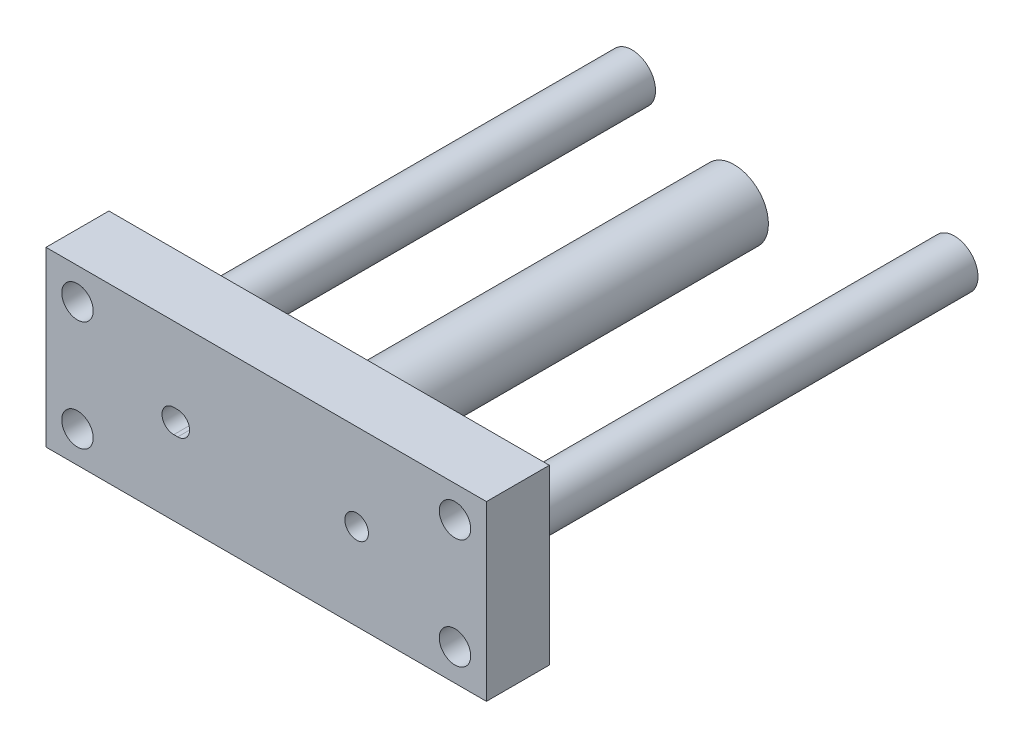
ISO-10303-21;
HEADER;
FILE_DESCRIPTION(('STEP AP214'),'2;1');
FILE_NAME('part.step','',(''),(''),'','','');
FILE_SCHEMA(('AUTOMOTIVE_DESIGN { 1 0 10303 214 1 1 1 1 }'));
ENDSEC;
DATA;
#1=APPLICATION_CONTEXT('core data for automotive mechanical design processes');
#2=APPLICATION_PROTOCOL_DEFINITION('international standard','automotive_design',2000,#1);
#3=PRODUCT_CONTEXT('',#1,'mechanical');
#4=PRODUCT('Part','Part','',(#3));
#5=PRODUCT_RELATED_PRODUCT_CATEGORY('part','',(#4));
#6=PRODUCT_DEFINITION_FORMATION('','',#4);
#7=PRODUCT_DEFINITION_CONTEXT('part definition',#1,'design');
#8=PRODUCT_DEFINITION('design','',#6,#7);
#9=PRODUCT_DEFINITION_SHAPE('','',#8);
#10=(LENGTH_UNIT() NAMED_UNIT(*) SI_UNIT(.MILLI.,.METRE.));
#11=(NAMED_UNIT(*) PLANE_ANGLE_UNIT() SI_UNIT($,.RADIAN.));
#12=(NAMED_UNIT(*) SI_UNIT($,.STERADIAN.) SOLID_ANGLE_UNIT());
#13=UNCERTAINTY_MEASURE_WITH_UNIT(LENGTH_MEASURE(1.E-05),#10,'distance_accuracy_value','');
#14=(GEOMETRIC_REPRESENTATION_CONTEXT(3) GLOBAL_UNCERTAINTY_ASSIGNED_CONTEXT((#13)) GLOBAL_UNIT_ASSIGNED_CONTEXT((#10,
#11,#12)) REPRESENTATION_CONTEXT('',''));
#15=CARTESIAN_POINT('',(0.,0.,0.));
#16=DIRECTION('',(0.,0.,1.));
#17=DIRECTION('',(1.,0.,0.));
#18=AXIS2_PLACEMENT_3D('',#15,#16,#17);
#19=CARTESIAN_POINT('',(-11.25,0.,10.));
#20=DIRECTION('',(0.,0.,1.));
#21=DIRECTION('',(1.,0.,0.));
#22=AXIS2_PLACEMENT_3D('',#19,#20,#21);
#23=PLANE('',#22);
#24=CARTESIAN_POINT('',(-11.5,0.,10.));
#25=DIRECTION('',(0.,0.,1.));
#26=DIRECTION('',(1.,0.,0.));
#27=AXIS2_PLACEMENT_3D('',#24,#25,#26);
#28=CIRCLE('',#27,1.5);
#29=CARTESIAN_POINT('',(-11.5,1.5,10.));
#30=VERTEX_POINT('',#29);
#31=CARTESIAN_POINT('',(-11.5,-1.5,10.));
#32=VERTEX_POINT('',#31);
#33=EDGE_CURVE('E46',#30,#32,#28,.T.);
#34=ORIENTED_EDGE('',*,*,#33,.F.);
#35=DIRECTION('',(-1.,0.,0.));
#36=VECTOR('',#35,1.);
#37=CARTESIAN_POINT('',(-11.75,1.5,10.));
#38=LINE('',#37,#36);
#39=CARTESIAN_POINT('',(-11.75,1.5,10.));
#40=VERTEX_POINT('',#39);
#41=EDGE_CURVE('E112',#30,#40,#38,.T.);
#42=ORIENTED_EDGE('',*,*,#41,.T.);
#43=CARTESIAN_POINT('',(-11.75,0.,10.));
#44=DIRECTION('',(0.,0.,1.));
#45=DIRECTION('',(1.,0.,0.));
#46=AXIS2_PLACEMENT_3D('',#43,#44,#45);
#47=CIRCLE('',#46,1.5);
#48=CARTESIAN_POINT('',(-11.75,-1.5,10.));
#49=VERTEX_POINT('',#48);
#50=EDGE_CURVE('E130',#40,#49,#47,.T.);
#51=ORIENTED_EDGE('',*,*,#50,.T.);
#52=DIRECTION('',(1.,0.,0.));
#53=VECTOR('',#52,1.);
#54=CARTESIAN_POINT('',(-11.75,-1.5,10.));
#55=LINE('',#54,#53);
#56=EDGE_CURVE('E115',#49,#32,#55,.T.);
#57=ORIENTED_EDGE('',*,*,#56,.T.);
#58=EDGE_LOOP('',(#34,#42,#51,#57));
#59=FACE_BOUND('',#58,.T.);
#60=ADVANCED_FACE('F35',(#59),#23,.T.);
#61=CARTESIAN_POINT('',(-28.,-11.,13.));
#62=DIRECTION('',(0.,0.,1.));
#63=DIRECTION('',(1.,0.,0.));
#64=AXIS2_PLACEMENT_3D('',#61,#62,#63);
#65=PLANE('',#64);
#66=CARTESIAN_POINT('',(11.5,0.,13.));
#67=DIRECTION('',(0.,0.,1.));
#68=DIRECTION('',(1.,0.,0.));
#69=AXIS2_PLACEMENT_3D('',#66,#67,#68);
#70=CIRCLE('',#69,1.5);
#71=CARTESIAN_POINT('',(13.,0.,13.));
#72=VERTEX_POINT('',#71);
#73=EDGE_CURVE('E140',#72,#72,#70,.T.);
#74=ORIENTED_EDGE('',*,*,#73,.F.);
#75=EDGE_LOOP('',(#74));
#76=FACE_BOUND('',#75,.T.);
#77=CARTESIAN_POINT('',(-11.25,0.,13.));
#78=DIRECTION('',(0.,0.,1.));
#79=DIRECTION('',(1.,0.,0.));
#80=AXIS2_PLACEMENT_3D('',#77,#78,#79);
#81=CIRCLE('',#80,1.5);
#82=CARTESIAN_POINT('',(-11.25,-1.5,13.));
#83=VERTEX_POINT('',#82);
#84=CARTESIAN_POINT('',(-11.25,1.5,13.));
#85=VERTEX_POINT('',#84);
#86=EDGE_CURVE('E58',#83,#85,#81,.T.);
#87=ORIENTED_EDGE('',*,*,#86,.F.);
#88=DIRECTION('',(1.,0.,0.));
#89=VECTOR('',#88,1.);
#90=CARTESIAN_POINT('',(-11.75,-1.5,13.));
#91=LINE('',#90,#89);
#92=CARTESIAN_POINT('',(-11.75,-1.5,13.));
#93=VERTEX_POINT('',#92);
#94=EDGE_CURVE('E145',#93,#83,#91,.T.);
#95=ORIENTED_EDGE('',*,*,#94,.F.);
#96=CARTESIAN_POINT('',(-11.75,0.,13.));
#97=DIRECTION('',(0.,0.,1.));
#98=DIRECTION('',(1.,0.,0.));
#99=AXIS2_PLACEMENT_3D('',#96,#97,#98);
#100=CIRCLE('',#99,1.5);
#101=CARTESIAN_POINT('',(-11.75,1.5,13.));
#102=VERTEX_POINT('',#101);
#103=EDGE_CURVE('E142',#102,#93,#100,.T.);
#104=ORIENTED_EDGE('',*,*,#103,.F.);
#105=DIRECTION('',(-1.,0.,0.));
#106=VECTOR('',#105,1.);
#107=CARTESIAN_POINT('',(-11.75,1.5,13.));
#108=LINE('',#107,#106);
#109=EDGE_CURVE('E139',#85,#102,#108,.T.);
#110=ORIENTED_EDGE('',*,*,#109,.F.);
#111=EDGE_LOOP('',(#87,#95,#104,#110));
#112=FACE_BOUND('',#111,.T.);
#113=CARTESIAN_POINT('',(-24.,-7.,13.));
#114=DIRECTION('',(0.,0.,-1.));
#115=DIRECTION('',(1.,0.,0.));
#116=AXIS2_PLACEMENT_3D('',#113,#114,#115);
#117=CIRCLE('',#116,2.);
#118=CARTESIAN_POINT('',(-22.,-7.,13.));
#119=VERTEX_POINT('',#118);
#120=EDGE_CURVE('E164',#119,#119,#117,.T.);
#121=ORIENTED_EDGE('',*,*,#120,.T.);
#122=EDGE_LOOP('',(#121));
#123=FACE_BOUND('',#122,.T.);
#124=CARTESIAN_POINT('',(-24.,7.,13.));
#125=DIRECTION('',(0.,0.,1.));
#126=DIRECTION('',(1.,0.,0.));
#127=AXIS2_PLACEMENT_3D('',#124,#125,#126);
#128=CIRCLE('',#127,2.);
#129=CARTESIAN_POINT('',(-22.,7.,13.));
#130=VERTEX_POINT('',#129);
#131=EDGE_CURVE('E170',#130,#130,#128,.T.);
#132=ORIENTED_EDGE('',*,*,#131,.F.);
#133=EDGE_LOOP('',(#132));
#134=FACE_BOUND('',#133,.T.);
#135=DIRECTION('',(0.,-1.,0.));
#136=VECTOR('',#135,1.);
#137=CARTESIAN_POINT('',(-28.,11.,13.));
#138=LINE('',#137,#136);
#139=CARTESIAN_POINT('',(-28.,11.,13.));
#140=VERTEX_POINT('',#139);
#141=CARTESIAN_POINT('',(-28.,-11.,13.));
#142=VERTEX_POINT('',#141);
#143=EDGE_CURVE('E189',#140,#142,#138,.T.);
#144=ORIENTED_EDGE('',*,*,#143,.T.);
#145=DIRECTION('',(1.,0.,0.));
#146=VECTOR('',#145,1.);
#147=CARTESIAN_POINT('',(-28.,-11.,13.));
#148=LINE('',#147,#146);
#149=CARTESIAN_POINT('',(28.,-11.,13.));
#150=VERTEX_POINT('',#149);
#151=EDGE_CURVE('E192',#142,#150,#148,.T.);
#152=ORIENTED_EDGE('',*,*,#151,.T.);
#153=DIRECTION('',(0.,1.,0.));
#154=VECTOR('',#153,1.);
#155=CARTESIAN_POINT('',(28.,11.,13.));
#156=LINE('',#155,#154);
#157=CARTESIAN_POINT('',(28.,11.,13.));
#158=VERTEX_POINT('',#157);
#159=EDGE_CURVE('E195',#150,#158,#156,.T.);
#160=ORIENTED_EDGE('',*,*,#159,.T.);
#161=DIRECTION('',(-1.,0.,0.));
#162=VECTOR('',#161,1.);
#163=CARTESIAN_POINT('',(-28.,11.,13.));
#164=LINE('',#163,#162);
#165=EDGE_CURVE('E197',#158,#140,#164,.T.);
#166=ORIENTED_EDGE('',*,*,#165,.T.);
#167=EDGE_LOOP('',(#144,#152,#160,#166));
#168=FACE_BOUND('',#167,.T.);
#169=CARTESIAN_POINT('',(24.,-7.,13.));
#170=DIRECTION('',(0.,0.,1.));
#171=DIRECTION('',(-1.,0.,0.));
#172=AXIS2_PLACEMENT_3D('',#169,#170,#171);
#173=CIRCLE('',#172,2.);
#174=CARTESIAN_POINT('',(22.,-7.,13.));
#175=VERTEX_POINT('',#174);
#176=EDGE_CURVE('E158',#175,#175,#173,.T.);
#177=ORIENTED_EDGE('',*,*,#176,.F.);
#178=EDGE_LOOP('',(#177));
#179=FACE_BOUND('',#178,.T.);
#180=CARTESIAN_POINT('',(24.,7.,13.));
#181=DIRECTION('',(0.,0.,-1.));
#182=DIRECTION('',(-1.,0.,0.));
#183=AXIS2_PLACEMENT_3D('',#180,#181,#182);
#184=CIRCLE('',#183,2.);
#185=CARTESIAN_POINT('',(22.,7.,13.));
#186=VERTEX_POINT('',#185);
#187=EDGE_CURVE('E150',#186,#186,#184,.T.);
#188=ORIENTED_EDGE('',*,*,#187,.T.);
#189=EDGE_LOOP('',(#188));
#190=FACE_BOUND('',#189,.T.);
#191=ADVANCED_FACE('F242',(#76,#112,#123,#134,#168,#179,#190),#65,.T.);
#192=CARTESIAN_POINT('',(-28.,-11.,5.));
#193=DIRECTION('',(0.,0.,1.));
#194=DIRECTION('',(1.,0.,0.));
#195=AXIS2_PLACEMENT_3D('',#192,#193,#194);
#196=PLANE('',#195);
#197=CARTESIAN_POINT('',(24.,-7.,5.));
#198=DIRECTION('',(0.,0.,1.));
#199=DIRECTION('',(-1.,0.,0.));
#200=AXIS2_PLACEMENT_3D('',#197,#198,#199);
#201=CIRCLE('',#200,2.);
#202=CARTESIAN_POINT('',(22.,-7.,5.));
#203=VERTEX_POINT('',#202);
#204=EDGE_CURVE('E161',#203,#203,#201,.T.);
#205=ORIENTED_EDGE('',*,*,#204,.T.);
#206=EDGE_LOOP('',(#205));
#207=FACE_BOUND('',#206,.T.);
#208=CARTESIAN_POINT('',(-24.,7.,5.));
#209=DIRECTION('',(0.,0.,1.));
#210=DIRECTION('',(1.,0.,0.));
#211=AXIS2_PLACEMENT_3D('',#208,#209,#210);
#212=CIRCLE('',#211,2.);
#213=CARTESIAN_POINT('',(-22.,7.,5.));
#214=VERTEX_POINT('',#213);
#215=EDGE_CURVE('E173',#214,#214,#212,.T.);
#216=ORIENTED_EDGE('',*,*,#215,.T.);
#217=EDGE_LOOP('',(#216));
#218=FACE_BOUND('',#217,.T.);
#219=CARTESIAN_POINT('',(0.,0.,5.));
#220=DIRECTION('',(0.,0.,1.));
#221=DIRECTION('',(1.,0.,0.));
#222=AXIS2_PLACEMENT_3D('',#219,#220,#221);
#223=CIRCLE('',#222,4.34999999999999);
#224=CARTESIAN_POINT('',(4.34999999999999,0.,5.));
#225=VERTEX_POINT('',#224);
#226=EDGE_CURVE('E39',#225,#225,#223,.T.);
#227=ORIENTED_EDGE('',*,*,#226,.T.);
#228=EDGE_LOOP('',(#227));
#229=FACE_BOUND('',#228,.T.);
#230=CARTESIAN_POINT('',(-20.5,0.,5.));
#231=DIRECTION('',(0.,0.,1.));
#232=DIRECTION('',(1.,0.,0.));
#233=AXIS2_PLACEMENT_3D('',#230,#231,#232);
#234=CIRCLE('',#233,3.);
#235=CARTESIAN_POINT('',(-17.5,0.,5.));
#236=VERTEX_POINT('',#235);
#237=EDGE_CURVE('E184',#236,#236,#234,.T.);
#238=ORIENTED_EDGE('',*,*,#237,.T.);
#239=EDGE_LOOP('',(#238));
#240=FACE_BOUND('',#239,.T.);
#241=CARTESIAN_POINT('',(20.5,0.,5.));
#242=DIRECTION('',(0.,0.,1.));
#243=DIRECTION('',(1.,0.,0.));
#244=AXIS2_PLACEMENT_3D('',#241,#242,#243);
#245=CIRCLE('',#244,3.);
#246=CARTESIAN_POINT('',(23.5,0.,5.));
#247=VERTEX_POINT('',#246);
#248=EDGE_CURVE('E188',#247,#247,#245,.T.);
#249=ORIENTED_EDGE('',*,*,#248,.T.);
#250=EDGE_LOOP('',(#249));
#251=FACE_BOUND('',#250,.T.);
#252=DIRECTION('',(0.,-1.,0.));
#253=VECTOR('',#252,1.);
#254=CARTESIAN_POINT('',(-28.,11.,5.));
#255=LINE('',#254,#253);
#256=CARTESIAN_POINT('',(-28.,11.,5.));
#257=VERTEX_POINT('',#256);
#258=CARTESIAN_POINT('',(-28.,-11.,5.));
#259=VERTEX_POINT('',#258);
#260=EDGE_CURVE('E200',#257,#259,#255,.T.);
#261=ORIENTED_EDGE('',*,*,#260,.F.);
#262=DIRECTION('',(-1.,0.,0.));
#263=VECTOR('',#262,1.);
#264=CARTESIAN_POINT('',(-28.,11.,5.));
#265=LINE('',#264,#263);
#266=CARTESIAN_POINT('',(28.,11.,5.));
#267=VERTEX_POINT('',#266);
#268=EDGE_CURVE('E193',#267,#257,#265,.T.);
#269=ORIENTED_EDGE('',*,*,#268,.F.);
#270=DIRECTION('',(0.,1.,0.));
#271=VECTOR('',#270,1.);
#272=CARTESIAN_POINT('',(28.,11.,5.));
#273=LINE('',#272,#271);
#274=CARTESIAN_POINT('',(28.,-11.,5.));
#275=VERTEX_POINT('',#274);
#276=EDGE_CURVE('E205',#275,#267,#273,.T.);
#277=ORIENTED_EDGE('',*,*,#276,.F.);
#278=DIRECTION('',(1.,0.,0.));
#279=VECTOR('',#278,1.);
#280=CARTESIAN_POINT('',(-28.,-11.,5.));
#281=LINE('',#280,#279);
#282=EDGE_CURVE('E203',#259,#275,#281,.T.);
#283=ORIENTED_EDGE('',*,*,#282,.F.);
#284=EDGE_LOOP('',(#261,#269,#277,#283));
#285=FACE_BOUND('',#284,.T.);
#286=CARTESIAN_POINT('',(-24.,-7.,5.));
#287=DIRECTION('',(0.,0.,-1.));
#288=DIRECTION('',(1.,0.,0.));
#289=AXIS2_PLACEMENT_3D('',#286,#287,#288);
#290=CIRCLE('',#289,2.);
#291=CARTESIAN_POINT('',(-22.,-7.,5.));
#292=VERTEX_POINT('',#291);
#293=EDGE_CURVE('E167',#292,#292,#290,.T.);
#294=ORIENTED_EDGE('',*,*,#293,.F.);
#295=EDGE_LOOP('',(#294));
#296=FACE_BOUND('',#295,.T.);
#297=CARTESIAN_POINT('',(24.,7.,5.));
#298=DIRECTION('',(0.,0.,-1.));
#299=DIRECTION('',(-1.,0.,0.));
#300=AXIS2_PLACEMENT_3D('',#297,#298,#299);
#301=CIRCLE('',#300,2.);
#302=CARTESIAN_POINT('',(22.,7.,5.));
#303=VERTEX_POINT('',#302);
#304=EDGE_CURVE('E155',#303,#303,#301,.T.);
#305=ORIENTED_EDGE('',*,*,#304,.F.);
#306=EDGE_LOOP('',(#305));
#307=FACE_BOUND('',#306,.T.);
#308=ADVANCED_FACE('F222',(#207,#218,#229,#240,#251,#285,#296,#307),#196,.F.);
#309=CARTESIAN_POINT('',(-28.,11.,13.));
#310=DIRECTION('',(1.,0.,0.));
#311=DIRECTION('',(0.,0.,-1.));
#312=AXIS2_PLACEMENT_3D('',#309,#310,#311);
#313=PLANE('',#312);
#314=ORIENTED_EDGE('',*,*,#260,.T.);
#315=DIRECTION('',(0.,0.,-1.));
#316=VECTOR('',#315,1.);
#317=CARTESIAN_POINT('',(-28.,-11.,13.));
#318=LINE('',#317,#316);
#319=EDGE_CURVE('E44',#142,#259,#318,.T.);
#320=ORIENTED_EDGE('',*,*,#319,.F.);
#321=ORIENTED_EDGE('',*,*,#143,.F.);
#322=DIRECTION('',(0.,0.,-1.));
#323=VECTOR('',#322,1.);
#324=CARTESIAN_POINT('',(-28.,11.,13.));
#325=LINE('',#324,#323);
#326=EDGE_CURVE('E199',#140,#257,#325,.T.);
#327=ORIENTED_EDGE('',*,*,#326,.T.);
#328=EDGE_LOOP('',(#314,#320,#321,#327));
#329=FACE_BOUND('',#328,.T.);
#330=ADVANCED_FACE('F37',(#329),#313,.F.);
#331=CARTESIAN_POINT('',(-28.,-11.,13.));
#332=DIRECTION('',(0.,1.,0.));
#333=DIRECTION('',(-1.,0.,0.));
#334=AXIS2_PLACEMENT_3D('',#331,#332,#333);
#335=PLANE('',#334);
#336=ORIENTED_EDGE('',*,*,#282,.T.);
#337=DIRECTION('',(0.,0.,-1.));
#338=VECTOR('',#337,1.);
#339=CARTESIAN_POINT('',(28.,-11.,13.));
#340=LINE('',#339,#338);
#341=EDGE_CURVE('E213',#150,#275,#340,.T.);
#342=ORIENTED_EDGE('',*,*,#341,.F.);
#343=ORIENTED_EDGE('',*,*,#151,.F.);
#344=ORIENTED_EDGE('',*,*,#319,.T.);
#345=EDGE_LOOP('',(#336,#342,#343,#344));
#346=FACE_BOUND('',#345,.T.);
#347=ADVANCED_FACE('F305',(#346),#335,.F.);
#348=CARTESIAN_POINT('',(28.,11.,13.));
#349=DIRECTION('',(-1.,0.,0.));
#350=DIRECTION('',(0.,-1.,0.));
#351=AXIS2_PLACEMENT_3D('',#348,#349,#350);
#352=PLANE('',#351);
#353=ORIENTED_EDGE('',*,*,#276,.T.);
#354=DIRECTION('',(0.,0.,-1.));
#355=VECTOR('',#354,1.);
#356=CARTESIAN_POINT('',(28.,11.,13.));
#357=LINE('',#356,#355);
#358=EDGE_CURVE('E210',#158,#267,#357,.T.);
#359=ORIENTED_EDGE('',*,*,#358,.F.);
#360=ORIENTED_EDGE('',*,*,#159,.F.);
#361=ORIENTED_EDGE('',*,*,#341,.T.);
#362=EDGE_LOOP('',(#353,#359,#360,#361));
#363=FACE_BOUND('',#362,.T.);
#364=ADVANCED_FACE('F313',(#363),#352,.F.);
#365=CARTESIAN_POINT('',(-28.,11.,13.));
#366=DIRECTION('',(0.,-1.,0.));
#367=DIRECTION('',(1.,0.,0.));
#368=AXIS2_PLACEMENT_3D('',#365,#366,#367);
#369=PLANE('',#368);
#370=ORIENTED_EDGE('',*,*,#268,.T.);
#371=ORIENTED_EDGE('',*,*,#326,.F.);
#372=ORIENTED_EDGE('',*,*,#165,.F.);
#373=ORIENTED_EDGE('',*,*,#358,.T.);
#374=EDGE_LOOP('',(#370,#371,#372,#373));
#375=FACE_BOUND('',#374,.T.);
#376=ADVANCED_FACE('F310',(#375),#369,.F.);
#377=CARTESIAN_POINT('',(20.5,0.,-54.));
#378=DIRECTION('',(0.,0.,1.));
#379=DIRECTION('',(1.,0.,0.));
#380=AXIS2_PLACEMENT_3D('',#377,#378,#379);
#381=CYLINDRICAL_SURFACE('',#380,3.);
#382=CARTESIAN_POINT('',(20.5,0.,-54.));
#383=DIRECTION('',(0.,0.,1.));
#384=DIRECTION('',(1.,0.,0.));
#385=AXIS2_PLACEMENT_3D('',#382,#383,#384);
#386=CIRCLE('',#385,3.);
#387=CARTESIAN_POINT('',(23.5,0.,-54.));
#388=VERTEX_POINT('',#387);
#389=EDGE_CURVE('E185',#388,#388,#386,.T.);
#390=ORIENTED_EDGE('',*,*,#389,.T.);
#391=EDGE_LOOP('',(#390));
#392=FACE_BOUND('',#391,.T.);
#393=ORIENTED_EDGE('',*,*,#248,.F.);
#394=EDGE_LOOP('',(#393));
#395=FACE_BOUND('',#394,.T.);
#396=ADVANCED_FACE('F238',(#392,#395),#381,.T.);
#397=CARTESIAN_POINT('',(20.5,0.,-54.));
#398=DIRECTION('',(0.,0.,1.));
#399=DIRECTION('',(1.,0.,0.));
#400=AXIS2_PLACEMENT_3D('',#397,#398,#399);
#401=PLANE('',#400);
#402=ORIENTED_EDGE('',*,*,#389,.F.);
#403=EDGE_LOOP('',(#402));
#404=FACE_BOUND('',#403,.T.);
#405=ADVANCED_FACE('F228',(#404),#401,.F.);
#406=CARTESIAN_POINT('',(-20.5,0.,-54.));
#407=DIRECTION('',(0.,0.,1.));
#408=DIRECTION('',(1.,0.,0.));
#409=AXIS2_PLACEMENT_3D('',#406,#407,#408);
#410=CYLINDRICAL_SURFACE('',#409,3.);
#411=CARTESIAN_POINT('',(-20.5,0.,-54.));
#412=DIRECTION('',(0.,0.,1.));
#413=DIRECTION('',(1.,0.,0.));
#414=AXIS2_PLACEMENT_3D('',#411,#412,#413);
#415=CIRCLE('',#414,3.);
#416=CARTESIAN_POINT('',(-17.5,0.,-54.));
#417=VERTEX_POINT('',#416);
#418=EDGE_CURVE('E181',#417,#417,#415,.T.);
#419=ORIENTED_EDGE('',*,*,#418,.T.);
#420=EDGE_LOOP('',(#419));
#421=FACE_BOUND('',#420,.T.);
#422=ORIENTED_EDGE('',*,*,#237,.F.);
#423=EDGE_LOOP('',(#422));
#424=FACE_BOUND('',#423,.T.);
#425=ADVANCED_FACE('F225',(#421,#424),#410,.T.);
#426=CARTESIAN_POINT('',(-20.5,0.,-54.));
#427=DIRECTION('',(0.,0.,1.));
#428=DIRECTION('',(1.,0.,0.));
#429=AXIS2_PLACEMENT_3D('',#426,#427,#428);
#430=PLANE('',#429);
#431=ORIENTED_EDGE('',*,*,#418,.F.);
#432=EDGE_LOOP('',(#431));
#433=FACE_BOUND('',#432,.T.);
#434=ADVANCED_FACE('F227',(#433),#430,.F.);
#435=CARTESIAN_POINT('',(0.,0.,-46.5));
#436=DIRECTION('',(0.,0.,1.));
#437=DIRECTION('',(1.,0.,0.));
#438=AXIS2_PLACEMENT_3D('',#435,#436,#437);
#439=CYLINDRICAL_SURFACE('',#438,4.34999999999999);
#440=CARTESIAN_POINT('',(0.,0.,-46.5));
#441=DIRECTION('',(0.,0.,1.));
#442=DIRECTION('',(1.,0.,0.));
#443=AXIS2_PLACEMENT_3D('',#440,#441,#442);
#444=CIRCLE('',#443,4.34999999999999);
#445=CARTESIAN_POINT('',(4.34999999999999,0.,-46.5));
#446=VERTEX_POINT('',#445);
#447=EDGE_CURVE('E176',#446,#446,#444,.T.);
#448=ORIENTED_EDGE('',*,*,#447,.T.);
#449=EDGE_LOOP('',(#448));
#450=FACE_BOUND('',#449,.T.);
#451=ORIENTED_EDGE('',*,*,#226,.F.);
#452=EDGE_LOOP('',(#451));
#453=FACE_BOUND('',#452,.T.);
#454=ADVANCED_FACE('F235',(#450,#453),#439,.T.);
#455=CARTESIAN_POINT('',(0.,0.,-46.5));
#456=DIRECTION('',(0.,0.,1.));
#457=DIRECTION('',(1.,0.,0.));
#458=AXIS2_PLACEMENT_3D('',#455,#456,#457);
#459=PLANE('',#458);
#460=ORIENTED_EDGE('',*,*,#447,.F.);
#461=EDGE_LOOP('',(#460));
#462=FACE_BOUND('',#461,.T.);
#463=ADVANCED_FACE('F285',(#462),#459,.F.);
#464=CARTESIAN_POINT('',(-24.,7.,5.));
#465=DIRECTION('',(0.,0.,1.));
#466=DIRECTION('',(1.,0.,0.));
#467=AXIS2_PLACEMENT_3D('',#464,#465,#466);
#468=CYLINDRICAL_SURFACE('',#467,2.);
#469=ORIENTED_EDGE('',*,*,#215,.F.);
#470=EDGE_LOOP('',(#469));
#471=FACE_BOUND('',#470,.T.);
#472=ORIENTED_EDGE('',*,*,#131,.T.);
#473=EDGE_LOOP('',(#472));
#474=FACE_BOUND('',#473,.T.);
#475=ADVANCED_FACE('F281',(#471,#474),#468,.F.);
#476=CARTESIAN_POINT('',(-24.,-7.,5.));
#477=DIRECTION('',(0.,0.,1.));
#478=DIRECTION('',(1.,0.,0.));
#479=AXIS2_PLACEMENT_3D('',#476,#477,#478);
#480=CYLINDRICAL_SURFACE('',#479,2.);
#481=ORIENTED_EDGE('',*,*,#293,.T.);
#482=EDGE_LOOP('',(#481));
#483=FACE_BOUND('',#482,.T.);
#484=ORIENTED_EDGE('',*,*,#120,.F.);
#485=EDGE_LOOP('',(#484));
#486=FACE_BOUND('',#485,.T.);
#487=ADVANCED_FACE('F277',(#483,#486),#480,.F.);
#488=CARTESIAN_POINT('',(24.,-7.,5.));
#489=DIRECTION('',(0.,0.,1.));
#490=DIRECTION('',(1.,0.,0.));
#491=AXIS2_PLACEMENT_3D('',#488,#489,#490);
#492=CYLINDRICAL_SURFACE('',#491,2.);
#493=ORIENTED_EDGE('',*,*,#204,.F.);
#494=EDGE_LOOP('',(#493));
#495=FACE_BOUND('',#494,.T.);
#496=ORIENTED_EDGE('',*,*,#176,.T.);
#497=EDGE_LOOP('',(#496));
#498=FACE_BOUND('',#497,.T.);
#499=ADVANCED_FACE('F273',(#495,#498),#492,.F.);
#500=CARTESIAN_POINT('',(24.,7.,5.));
#501=DIRECTION('',(0.,0.,1.));
#502=DIRECTION('',(1.,0.,0.));
#503=AXIS2_PLACEMENT_3D('',#500,#501,#502);
#504=CYLINDRICAL_SURFACE('',#503,2.);
#505=ORIENTED_EDGE('',*,*,#304,.T.);
#506=EDGE_LOOP('',(#505));
#507=FACE_BOUND('',#506,.T.);
#508=ORIENTED_EDGE('',*,*,#187,.F.);
#509=EDGE_LOOP('',(#508));
#510=FACE_BOUND('',#509,.T.);
#511=ADVANCED_FACE('F270',(#507,#510),#504,.F.);
#512=CARTESIAN_POINT('',(-11.25,0.,10.));
#513=DIRECTION('',(0.,0.,1.));
#514=DIRECTION('',(1.,0.,0.));
#515=AXIS2_PLACEMENT_3D('',#512,#513,#514);
#516=CYLINDRICAL_SURFACE('',#515,1.5);
#517=ORIENTED_EDGE('',*,*,#86,.T.);
#518=DIRECTION('',(0.,0.,1.));
#519=VECTOR('',#518,1.);
#520=CARTESIAN_POINT('',(-11.25,1.5,10.));
#521=LINE('',#520,#519);
#522=CARTESIAN_POINT('',(-11.25,1.5,10.));
#523=VERTEX_POINT('',#522);
#524=EDGE_CURVE('E137',#523,#85,#521,.T.);
#525=ORIENTED_EDGE('',*,*,#524,.F.);
#526=CARTESIAN_POINT('',(-11.25,0.,10.));
#527=DIRECTION('',(0.,0.,1.));
#528=DIRECTION('',(1.,0.,0.));
#529=AXIS2_PLACEMENT_3D('',#526,#527,#528);
#530=CIRCLE('',#529,1.5);
#531=CARTESIAN_POINT('',(-11.25,-1.5,10.));
#532=VERTEX_POINT('',#531);
#533=EDGE_CURVE('E126',#532,#523,#530,.T.);
#534=ORIENTED_EDGE('',*,*,#533,.F.);
#535=DIRECTION('',(0.,0.,1.));
#536=VECTOR('',#535,1.);
#537=CARTESIAN_POINT('',(-11.25,-1.5,10.));
#538=LINE('',#537,#536);
#539=EDGE_CURVE('E148',#532,#83,#538,.T.);
#540=ORIENTED_EDGE('',*,*,#539,.T.);
#541=EDGE_LOOP('',(#517,#525,#534,#540));
#542=FACE_BOUND('',#541,.T.);
#543=ADVANCED_FACE('F267',(#542),#516,.F.);
#544=CARTESIAN_POINT('',(-11.75,-1.5,10.));
#545=DIRECTION('',(0.,-1.,0.));
#546=DIRECTION('',(0.,0.,-1.));
#547=AXIS2_PLACEMENT_3D('',#544,#545,#546);
#548=PLANE('',#547);
#549=ORIENTED_EDGE('',*,*,#94,.T.);
#550=ORIENTED_EDGE('',*,*,#539,.F.);
#551=EDGE_CURVE('E131',#32,#532,#55,.T.);
#552=ORIENTED_EDGE('',*,*,#551,.F.);
#553=ORIENTED_EDGE('',*,*,#56,.F.);
#554=DIRECTION('',(0.,0.,1.));
#555=VECTOR('',#554,1.);
#556=CARTESIAN_POINT('',(-11.75,-1.5,10.));
#557=LINE('',#556,#555);
#558=EDGE_CURVE('E151',#49,#93,#557,.T.);
#559=ORIENTED_EDGE('',*,*,#558,.T.);
#560=EDGE_LOOP('',(#549,#550,#552,#553,#559));
#561=FACE_BOUND('',#560,.T.);
#562=ADVANCED_FACE('F263',(#561),#548,.F.);
#563=CARTESIAN_POINT('',(-11.75,0.,10.));
#564=DIRECTION('',(0.,0.,1.));
#565=DIRECTION('',(1.,0.,0.));
#566=AXIS2_PLACEMENT_3D('',#563,#564,#565);
#567=CYLINDRICAL_SURFACE('',#566,1.5);
#568=ORIENTED_EDGE('',*,*,#103,.T.);
#569=ORIENTED_EDGE('',*,*,#558,.F.);
#570=ORIENTED_EDGE('',*,*,#50,.F.);
#571=DIRECTION('',(0.,0.,1.));
#572=VECTOR('',#571,1.);
#573=CARTESIAN_POINT('',(-11.75,1.5,10.));
#574=LINE('',#573,#572);
#575=EDGE_CURVE('E124',#40,#102,#574,.T.);
#576=ORIENTED_EDGE('',*,*,#575,.T.);
#577=EDGE_LOOP('',(#568,#569,#570,#576));
#578=FACE_BOUND('',#577,.T.);
#579=ADVANCED_FACE('F258',(#578),#567,.F.);
#580=CARTESIAN_POINT('',(-11.75,1.5,10.));
#581=DIRECTION('',(0.,1.,0.));
#582=DIRECTION('',(0.,0.,1.));
#583=AXIS2_PLACEMENT_3D('',#580,#581,#582);
#584=PLANE('',#583);
#585=ORIENTED_EDGE('',*,*,#109,.T.);
#586=ORIENTED_EDGE('',*,*,#575,.F.);
#587=ORIENTED_EDGE('',*,*,#41,.F.);
#588=EDGE_CURVE('E122',#523,#30,#38,.T.);
#589=ORIENTED_EDGE('',*,*,#588,.F.);
#590=ORIENTED_EDGE('',*,*,#524,.T.);
#591=EDGE_LOOP('',(#585,#586,#587,#589,#590));
#592=FACE_BOUND('',#591,.T.);
#593=ADVANCED_FACE('F121',(#592),#584,.F.);
#594=EDGE_CURVE('E11',#32,#30,#28,.T.);
#595=ORIENTED_EDGE('',*,*,#594,.F.);
#596=ORIENTED_EDGE('',*,*,#551,.T.);
#597=ORIENTED_EDGE('',*,*,#533,.T.);
#598=ORIENTED_EDGE('',*,*,#588,.T.);
#599=EDGE_LOOP('',(#595,#596,#597,#598));
#600=FACE_BOUND('',#599,.T.);
#601=ADVANCED_FACE('F128',(#600),#23,.T.);
#602=CARTESIAN_POINT('',(11.5,0.,10.));
#603=DIRECTION('',(0.,0.,1.));
#604=DIRECTION('',(1.,0.,0.));
#605=AXIS2_PLACEMENT_3D('',#602,#603,#604);
#606=CYLINDRICAL_SURFACE('',#605,1.5);
#607=ORIENTED_EDGE('',*,*,#73,.T.);
#608=EDGE_LOOP('',(#607));
#609=FACE_BOUND('',#608,.T.);
#610=CARTESIAN_POINT('',(11.5,0.,7.));
#611=DIRECTION('',(0.,0.,1.));
#612=DIRECTION('',(1.,0.,0.));
#613=AXIS2_PLACEMENT_3D('',#610,#611,#612);
#614=CIRCLE('',#613,1.5);
#615=CARTESIAN_POINT('',(13.,0.,7.));
#616=VERTEX_POINT('',#615);
#617=EDGE_CURVE('E117',#616,#616,#614,.T.);
#618=ORIENTED_EDGE('',*,*,#617,.F.);
#619=EDGE_LOOP('',(#618));
#620=FACE_BOUND('',#619,.T.);
#621=ADVANCED_FACE('F252',(#609,#620),#606,.F.);
#622=CARTESIAN_POINT('',(-11.5,0.,7.));
#623=DIRECTION('',(0.,0.,1.));
#624=DIRECTION('',(1.,0.,0.));
#625=AXIS2_PLACEMENT_3D('',#622,#623,#624);
#626=CYLINDRICAL_SURFACE('',#625,1.5);
#627=CARTESIAN_POINT('',(-11.5,0.,7.));
#628=DIRECTION('',(0.,0.,1.));
#629=DIRECTION('',(1.,0.,0.));
#630=AXIS2_PLACEMENT_3D('',#627,#628,#629);
#631=CIRCLE('',#630,1.5);
#632=CARTESIAN_POINT('',(-9.99999999999999,0.,7.));
#633=VERTEX_POINT('',#632);
#634=EDGE_CURVE('E116',#633,#633,#631,.T.);
#635=ORIENTED_EDGE('',*,*,#634,.F.);
#636=EDGE_LOOP('',(#635));
#637=FACE_BOUND('',#636,.T.);
#638=ORIENTED_EDGE('',*,*,#33,.T.);
#639=ORIENTED_EDGE('',*,*,#594,.T.);
#640=EDGE_LOOP('',(#638,#639));
#641=FACE_BOUND('',#640,.T.);
#642=ADVANCED_FACE('F104',(#637,#641),#626,.F.);
#643=CARTESIAN_POINT('',(-11.5,0.,7.));
#644=DIRECTION('',(0.,0.,1.));
#645=DIRECTION('',(1.,0.,0.));
#646=AXIS2_PLACEMENT_3D('',#643,#644,#645);
#647=PLANE('',#646);
#648=ORIENTED_EDGE('',*,*,#634,.T.);
#649=EDGE_LOOP('',(#648));
#650=FACE_BOUND('',#649,.T.);
#651=ADVANCED_FACE('F471',(#650),#647,.T.);
#652=CARTESIAN_POINT('',(11.5,0.,7.));
#653=DIRECTION('',(0.,0.,1.));
#654=DIRECTION('',(1.,0.,0.));
#655=AXIS2_PLACEMENT_3D('',#652,#653,#654);
#656=PLANE('',#655);
#657=ORIENTED_EDGE('',*,*,#617,.T.);
#658=EDGE_LOOP('',(#657));
#659=FACE_BOUND('',#658,.T.);
#660=ADVANCED_FACE('F481',(#659),#656,.T.);
#661=CLOSED_SHELL('',(#60,#191,#308,#330,#347,#364,#376,#396,#405,#425,#434,#454,#463,#475,#487,
#499,#511,#543,#562,#579,#593,#601,#621,#642,#651,#660));
#662=MANIFOLD_SOLID_BREP('B2',#661);
#663=ADVANCED_BREP_SHAPE_REPRESENTATION('',(#18,#662),#14);
#664=SHAPE_DEFINITION_REPRESENTATION(#9,#663);
ENDSEC;
END-ISO-10303-21;
